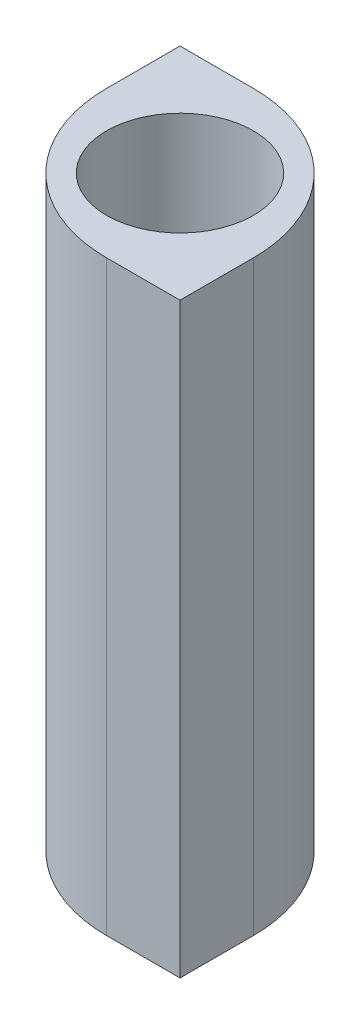
ISO-10303-21;
HEADER;
FILE_DESCRIPTION(('STEP AP214'),'2;1');
FILE_NAME('part.step','',(''),(''),'','','');
FILE_SCHEMA(('AUTOMOTIVE_DESIGN { 1 0 10303 214 1 1 1 1 }'));
ENDSEC;
DATA;
#1=APPLICATION_CONTEXT('core data for automotive mechanical design processes');
#2=APPLICATION_PROTOCOL_DEFINITION('international standard','automotive_design',2000,#1);
#3=PRODUCT_CONTEXT('',#1,'mechanical');
#4=PRODUCT('Part','Part','',(#3));
#5=PRODUCT_RELATED_PRODUCT_CATEGORY('part','',(#4));
#6=PRODUCT_DEFINITION_FORMATION('','',#4);
#7=PRODUCT_DEFINITION_CONTEXT('part definition',#1,'design');
#8=PRODUCT_DEFINITION('design','',#6,#7);
#9=PRODUCT_DEFINITION_SHAPE('','',#8);
#10=(LENGTH_UNIT() NAMED_UNIT(*) SI_UNIT(.MILLI.,.METRE.));
#11=(NAMED_UNIT(*) PLANE_ANGLE_UNIT() SI_UNIT($,.RADIAN.));
#12=(NAMED_UNIT(*) SI_UNIT($,.STERADIAN.) SOLID_ANGLE_UNIT());
#13=UNCERTAINTY_MEASURE_WITH_UNIT(LENGTH_MEASURE(1.E-05),#10,'distance_accuracy_value','');
#14=(GEOMETRIC_REPRESENTATION_CONTEXT(3) GLOBAL_UNCERTAINTY_ASSIGNED_CONTEXT((#13)) GLOBAL_UNIT_ASSIGNED_CONTEXT((#10,
#11,#12)) REPRESENTATION_CONTEXT('',''));
#15=CARTESIAN_POINT('',(0.,0.,0.));
#16=DIRECTION('',(0.,0.,1.));
#17=DIRECTION('',(1.,0.,0.));
#18=AXIS2_PLACEMENT_3D('',#15,#16,#17);
#19=CARTESIAN_POINT('',(0.,40.,0.));
#20=DIRECTION('',(0.,1.,0.));
#21=DIRECTION('',(0.,0.,1.));
#22=AXIS2_PLACEMENT_3D('',#19,#20,#21);
#23=PLANE('',#22);
#24=CARTESIAN_POINT('',(0.,40.,0.));
#25=DIRECTION('',(0.,1.,0.));
#26=DIRECTION('',(0.,0.,1.));
#27=AXIS2_PLACEMENT_3D('',#24,#25,#26);
#28=CIRCLE('',#27,5.);
#29=CARTESIAN_POINT('',(0.,40.,5.));
#30=VERTEX_POINT('',#29);
#31=EDGE_CURVE('E179',#30,#30,#28,.T.);
#32=ORIENTED_EDGE('',*,*,#31,.F.);
#33=EDGE_LOOP('',(#32));
#34=FACE_BOUND('',#33,.T.);
#35=DIRECTION('',(0.,0.,-1.));
#36=VECTOR('',#35,1.);
#37=CARTESIAN_POINT('',(7.5,40.,7.5));
#38=LINE('',#37,#36);
#39=CARTESIAN_POINT('',(7.5,40.,7.5));
#40=VERTEX_POINT('',#39);
#41=CARTESIAN_POINT('',(7.5,40.,2.5));
#42=VERTEX_POINT('',#41);
#43=EDGE_CURVE('E154',#40,#42,#38,.T.);
#44=ORIENTED_EDGE('',*,*,#43,.T.);
#45=CARTESIAN_POINT('',(-2.5,40.,2.5));
#46=DIRECTION('',(0.,1.,0.));
#47=DIRECTION('',(0.,0.,1.));
#48=AXIS2_PLACEMENT_3D('',#45,#46,#47);
#49=CIRCLE('',#48,10.);
#50=CARTESIAN_POINT('',(-2.5,40.,-7.5));
#51=VERTEX_POINT('',#50);
#52=EDGE_CURVE('E191',#42,#51,#49,.T.);
#53=ORIENTED_EDGE('',*,*,#52,.T.);
#54=DIRECTION('',(-1.,0.,0.));
#55=VECTOR('',#54,1.);
#56=CARTESIAN_POINT('',(-7.5,40.,-7.5));
#57=LINE('',#56,#55);
#58=CARTESIAN_POINT('',(-7.5,40.,-7.5));
#59=VERTEX_POINT('',#58);
#60=EDGE_CURVE('E170',#51,#59,#57,.T.);
#61=ORIENTED_EDGE('',*,*,#60,.T.);
#62=DIRECTION('',(0.,0.,1.));
#63=VECTOR('',#62,1.);
#64=CARTESIAN_POINT('',(-7.5,40.,7.5));
#65=LINE('',#64,#63);
#66=CARTESIAN_POINT('',(-7.5,40.,-2.5));
#67=VERTEX_POINT('',#66);
#68=EDGE_CURVE('E165',#59,#67,#65,.T.);
#69=ORIENTED_EDGE('',*,*,#68,.T.);
#70=CARTESIAN_POINT('',(2.5,40.,-2.5));
#71=DIRECTION('',(0.,1.,0.));
#72=DIRECTION('',(0.,0.,1.));
#73=AXIS2_PLACEMENT_3D('',#70,#71,#72);
#74=CIRCLE('',#73,10.);
#75=CARTESIAN_POINT('',(2.5,40.,7.5));
#76=VERTEX_POINT('',#75);
#77=EDGE_CURVE('E189',#67,#76,#74,.T.);
#78=ORIENTED_EDGE('',*,*,#77,.T.);
#79=DIRECTION('',(1.,0.,0.));
#80=VECTOR('',#79,1.);
#81=CARTESIAN_POINT('',(-7.5,40.,7.5));
#82=LINE('',#81,#80);
#83=EDGE_CURVE('E162',#76,#40,#82,.T.);
#84=ORIENTED_EDGE('',*,*,#83,.T.);
#85=EDGE_LOOP('',(#44,#53,#61,#69,#78,#84));
#86=FACE_BOUND('',#85,.T.);
#87=ADVANCED_FACE('F87',(#34,#86),#23,.T.);
#88=CARTESIAN_POINT('',(0.,0.,0.));
#89=DIRECTION('',(0.,1.,0.));
#90=DIRECTION('',(0.,0.,1.));
#91=AXIS2_PLACEMENT_3D('',#88,#89,#90);
#92=PLANE('',#91);
#93=CARTESIAN_POINT('',(0.,0.,0.));
#94=DIRECTION('',(0.,-1.,0.));
#95=DIRECTION('',(0.,0.,-1.));
#96=AXIS2_PLACEMENT_3D('',#93,#94,#95);
#97=CIRCLE('',#96,2.5);
#98=CARTESIAN_POINT('',(0.,0.,-2.5));
#99=VERTEX_POINT('',#98);
#100=EDGE_CURVE('E155',#99,#99,#97,.T.);
#101=ORIENTED_EDGE('',*,*,#100,.F.);
#102=EDGE_LOOP('',(#101));
#103=FACE_BOUND('',#102,.T.);
#104=DIRECTION('',(-1.,0.,0.));
#105=VECTOR('',#104,1.);
#106=CARTESIAN_POINT('',(-7.5,0.,-7.5));
#107=LINE('',#106,#105);
#108=CARTESIAN_POINT('',(-2.5,0.,-7.5));
#109=VERTEX_POINT('',#108);
#110=CARTESIAN_POINT('',(-7.5,0.,-7.5));
#111=VERTEX_POINT('',#110);
#112=EDGE_CURVE('E161',#109,#111,#107,.T.);
#113=ORIENTED_EDGE('',*,*,#112,.F.);
#114=CARTESIAN_POINT('',(-2.5,0.,2.5));
#115=DIRECTION('',(0.,1.,0.));
#116=DIRECTION('',(0.,0.,1.));
#117=AXIS2_PLACEMENT_3D('',#114,#115,#116);
#118=CIRCLE('',#117,10.);
#119=CARTESIAN_POINT('',(7.5,0.,2.5));
#120=VERTEX_POINT('',#119);
#121=EDGE_CURVE('E160',#109,#120,#118,.F.);
#122=ORIENTED_EDGE('',*,*,#121,.T.);
#123=DIRECTION('',(0.,0.,-1.));
#124=VECTOR('',#123,1.);
#125=CARTESIAN_POINT('',(7.5,0.,7.5));
#126=LINE('',#125,#124);
#127=CARTESIAN_POINT('',(7.5,0.,7.5));
#128=VERTEX_POINT('',#127);
#129=EDGE_CURVE('E151',#128,#120,#126,.T.);
#130=ORIENTED_EDGE('',*,*,#129,.F.);
#131=DIRECTION('',(1.,0.,0.));
#132=VECTOR('',#131,1.);
#133=CARTESIAN_POINT('',(-7.5,0.,7.5));
#134=LINE('',#133,#132);
#135=CARTESIAN_POINT('',(2.5,0.,7.5));
#136=VERTEX_POINT('',#135);
#137=EDGE_CURVE('E138',#136,#128,#134,.T.);
#138=ORIENTED_EDGE('',*,*,#137,.F.);
#139=CARTESIAN_POINT('',(2.5,0.,-2.5));
#140=DIRECTION('',(0.,1.,0.));
#141=DIRECTION('',(0.,0.,1.));
#142=AXIS2_PLACEMENT_3D('',#139,#140,#141);
#143=CIRCLE('',#142,10.);
#144=CARTESIAN_POINT('',(-7.5,0.,-2.5));
#145=VERTEX_POINT('',#144);
#146=EDGE_CURVE('E102',#136,#145,#143,.F.);
#147=ORIENTED_EDGE('',*,*,#146,.T.);
#148=DIRECTION('',(0.,0.,1.));
#149=VECTOR('',#148,1.);
#150=CARTESIAN_POINT('',(-7.5,0.,7.5));
#151=LINE('',#150,#149);
#152=EDGE_CURVE('E145',#111,#145,#151,.T.);
#153=ORIENTED_EDGE('',*,*,#152,.F.);
#154=EDGE_LOOP('',(#113,#122,#130,#138,#147,#153));
#155=FACE_BOUND('',#154,.T.);
#156=ADVANCED_FACE('F158',(#103,#155),#92,.F.);
#157=CARTESIAN_POINT('',(0.,10.,0.));
#158=DIRECTION('',(0.,1.,0.));
#159=DIRECTION('',(0.,0.,1.));
#160=AXIS2_PLACEMENT_3D('',#157,#158,#159);
#161=CYLINDRICAL_SURFACE('',#160,5.);
#162=CARTESIAN_POINT('',(0.,10.,0.));
#163=DIRECTION('',(0.,1.,0.));
#164=DIRECTION('',(0.,0.,1.));
#165=AXIS2_PLACEMENT_3D('',#162,#163,#164);
#166=CIRCLE('',#165,5.);
#167=CARTESIAN_POINT('',(0.,10.,5.));
#168=VERTEX_POINT('',#167);
#169=EDGE_CURVE('E182',#168,#168,#166,.T.);
#170=ORIENTED_EDGE('',*,*,#169,.F.);
#171=EDGE_LOOP('',(#170));
#172=FACE_BOUND('',#171,.T.);
#173=ORIENTED_EDGE('',*,*,#31,.T.);
#174=EDGE_LOOP('',(#173));
#175=FACE_BOUND('',#174,.T.);
#176=ADVANCED_FACE('F221',(#172,#175),#161,.F.);
#177=CARTESIAN_POINT('',(0.,10.,0.));
#178=DIRECTION('',(0.,1.,0.));
#179=DIRECTION('',(0.,0.,1.));
#180=AXIS2_PLACEMENT_3D('',#177,#178,#179);
#181=PLANE('',#180);
#182=CARTESIAN_POINT('',(0.,10.,0.));
#183=DIRECTION('',(0.,-1.,0.));
#184=DIRECTION('',(0.,0.,-1.));
#185=AXIS2_PLACEMENT_3D('',#182,#183,#184);
#186=CIRCLE('',#185,2.5);
#187=CARTESIAN_POINT('',(0.,10.,-2.5));
#188=VERTEX_POINT('',#187);
#189=EDGE_CURVE('E176',#188,#188,#186,.T.);
#190=ORIENTED_EDGE('',*,*,#189,.T.);
#191=EDGE_LOOP('',(#190));
#192=FACE_BOUND('',#191,.T.);
#193=ORIENTED_EDGE('',*,*,#169,.T.);
#194=EDGE_LOOP('',(#193));
#195=FACE_BOUND('',#194,.T.);
#196=ADVANCED_FACE('F228',(#192,#195),#181,.T.);
#197=CARTESIAN_POINT('',(0.,10.,0.));
#198=DIRECTION('',(0.,-1.,0.));
#199=DIRECTION('',(0.,0.,-1.));
#200=AXIS2_PLACEMENT_3D('',#197,#198,#199);
#201=CYLINDRICAL_SURFACE('',#200,2.5);
#202=ORIENTED_EDGE('',*,*,#189,.F.);
#203=EDGE_LOOP('',(#202));
#204=FACE_BOUND('',#203,.T.);
#205=ORIENTED_EDGE('',*,*,#100,.T.);
#206=EDGE_LOOP('',(#205));
#207=FACE_BOUND('',#206,.T.);
#208=ADVANCED_FACE('F232',(#204,#207),#201,.F.);
#209=CARTESIAN_POINT('',(7.5,0.,7.5));
#210=DIRECTION('',(1.,0.,0.));
#211=DIRECTION('',(0.,0.,-1.));
#212=AXIS2_PLACEMENT_3D('',#209,#210,#211);
#213=PLANE('',#212);
#214=ORIENTED_EDGE('',*,*,#129,.T.);
#215=DIRECTION('',(0.,1.,0.));
#216=VECTOR('',#215,1.);
#217=CARTESIAN_POINT('',(7.5,0.,2.5));
#218=LINE('',#217,#216);
#219=EDGE_CURVE('E185',#120,#42,#218,.T.);
#220=ORIENTED_EDGE('',*,*,#219,.T.);
#221=ORIENTED_EDGE('',*,*,#43,.F.);
#222=DIRECTION('',(0.,1.,0.));
#223=VECTOR('',#222,1.);
#224=CARTESIAN_POINT('',(7.5,0.,7.5));
#225=LINE('',#224,#223);
#226=EDGE_CURVE('E141',#128,#40,#225,.T.);
#227=ORIENTED_EDGE('',*,*,#226,.F.);
#228=EDGE_LOOP('',(#214,#220,#221,#227));
#229=FACE_BOUND('',#228,.T.);
#230=ADVANCED_FACE('F149',(#229),#213,.T.);
#231=CARTESIAN_POINT('',(-7.5,0.,7.5));
#232=DIRECTION('',(0.,0.,1.));
#233=DIRECTION('',(1.,0.,0.));
#234=AXIS2_PLACEMENT_3D('',#231,#232,#233);
#235=PLANE('',#234);
#236=ORIENTED_EDGE('',*,*,#83,.F.);
#237=DIRECTION('',(0.,1.,0.));
#238=VECTOR('',#237,1.);
#239=CARTESIAN_POINT('',(2.5,0.,7.5));
#240=LINE('',#239,#238);
#241=EDGE_CURVE('E12',#76,#136,#240,.F.);
#242=ORIENTED_EDGE('',*,*,#241,.T.);
#243=ORIENTED_EDGE('',*,*,#137,.T.);
#244=ORIENTED_EDGE('',*,*,#226,.T.);
#245=EDGE_LOOP('',(#236,#242,#243,#244));
#246=FACE_BOUND('',#245,.T.);
#247=ADVANCED_FACE('F140',(#246),#235,.T.);
#248=CARTESIAN_POINT('',(-7.5,0.,7.5));
#249=DIRECTION('',(-1.,0.,0.));
#250=DIRECTION('',(0.,0.,1.));
#251=AXIS2_PLACEMENT_3D('',#248,#249,#250);
#252=PLANE('',#251);
#253=ORIENTED_EDGE('',*,*,#152,.T.);
#254=DIRECTION('',(0.,1.,0.));
#255=VECTOR('',#254,1.);
#256=CARTESIAN_POINT('',(-7.5,0.,-2.5));
#257=LINE('',#256,#255);
#258=EDGE_CURVE('E95',#145,#67,#257,.T.);
#259=ORIENTED_EDGE('',*,*,#258,.T.);
#260=ORIENTED_EDGE('',*,*,#68,.F.);
#261=DIRECTION('',(0.,1.,0.));
#262=VECTOR('',#261,1.);
#263=CARTESIAN_POINT('',(-7.5,0.,-7.5));
#264=LINE('',#263,#262);
#265=EDGE_CURVE('E144',#111,#59,#264,.T.);
#266=ORIENTED_EDGE('',*,*,#265,.F.);
#267=EDGE_LOOP('',(#253,#259,#260,#266));
#268=FACE_BOUND('',#267,.T.);
#269=ADVANCED_FACE('F200',(#268),#252,.T.);
#270=CARTESIAN_POINT('',(-7.5,0.,-7.5));
#271=DIRECTION('',(0.,0.,-1.));
#272=DIRECTION('',(-1.,0.,0.));
#273=AXIS2_PLACEMENT_3D('',#270,#271,#272);
#274=PLANE('',#273);
#275=ORIENTED_EDGE('',*,*,#60,.F.);
#276=DIRECTION('',(0.,1.,0.));
#277=VECTOR('',#276,1.);
#278=CARTESIAN_POINT('',(-2.5,0.,-7.5));
#279=LINE('',#278,#277);
#280=EDGE_CURVE('E193',#51,#109,#279,.F.);
#281=ORIENTED_EDGE('',*,*,#280,.T.);
#282=ORIENTED_EDGE('',*,*,#112,.T.);
#283=ORIENTED_EDGE('',*,*,#265,.T.);
#284=EDGE_LOOP('',(#275,#281,#282,#283));
#285=FACE_BOUND('',#284,.T.);
#286=ADVANCED_FACE('F207',(#285),#274,.T.);
#287=CARTESIAN_POINT('',(-2.5,0.,2.5));
#288=DIRECTION('',(0.,1.,0.));
#289=DIRECTION('',(0.,0.,1.));
#290=AXIS2_PLACEMENT_3D('',#287,#288,#289);
#291=CYLINDRICAL_SURFACE('',#290,10.);
#292=ORIENTED_EDGE('',*,*,#121,.F.);
#293=ORIENTED_EDGE('',*,*,#280,.F.);
#294=ORIENTED_EDGE('',*,*,#52,.F.);
#295=ORIENTED_EDGE('',*,*,#219,.F.);
#296=EDGE_LOOP('',(#292,#293,#294,#295));
#297=FACE_BOUND('',#296,.T.);
#298=ADVANCED_FACE('F209',(#297),#291,.T.);
#299=CARTESIAN_POINT('',(2.5,0.,-2.5));
#300=DIRECTION('',(0.,1.,0.));
#301=DIRECTION('',(0.,0.,1.));
#302=AXIS2_PLACEMENT_3D('',#299,#300,#301);
#303=CYLINDRICAL_SURFACE('',#302,10.);
#304=ORIENTED_EDGE('',*,*,#146,.F.);
#305=ORIENTED_EDGE('',*,*,#241,.F.);
#306=ORIENTED_EDGE('',*,*,#77,.F.);
#307=ORIENTED_EDGE('',*,*,#258,.F.);
#308=EDGE_LOOP('',(#304,#305,#306,#307));
#309=FACE_BOUND('',#308,.T.);
#310=ADVANCED_FACE('F89',(#309),#303,.T.);
#311=CLOSED_SHELL('',(#87,#156,#176,#196,#208,#230,#247,#269,#286,#298,#310));
#312=MANIFOLD_SOLID_BREP('B2',#311);
#313=ADVANCED_BREP_SHAPE_REPRESENTATION('',(#18,#312),#14);
#314=SHAPE_DEFINITION_REPRESENTATION(#9,#313);
ENDSEC;
END-ISO-10303-21;
